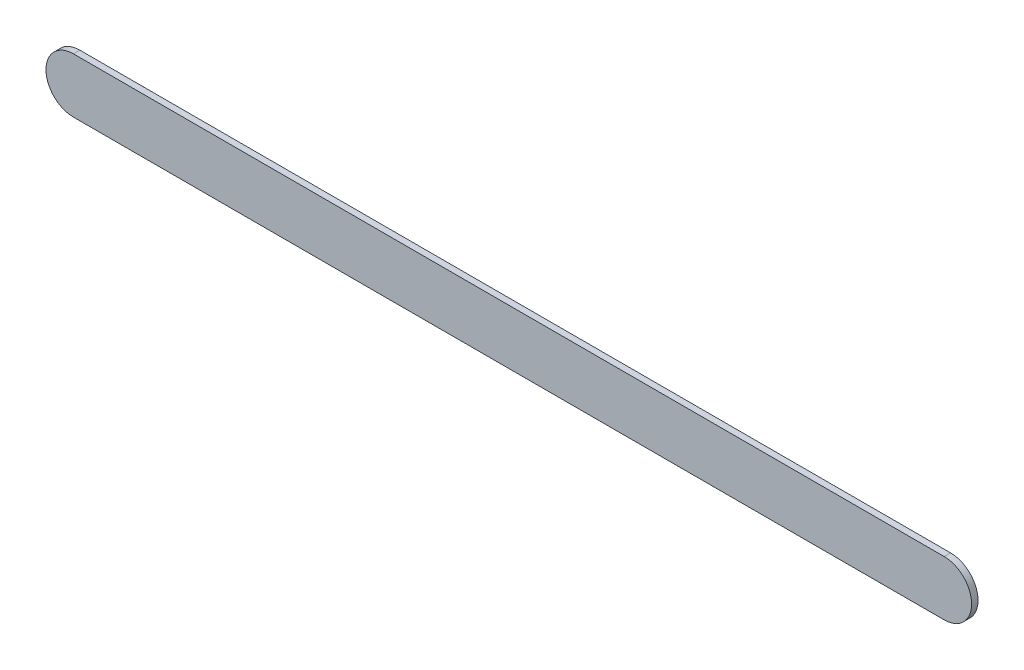
ISO-10303-21;
HEADER;
FILE_DESCRIPTION(('STEP AP214'),'2;1');
FILE_NAME('part.step','',(''),(''),'','','');
FILE_SCHEMA(('AUTOMOTIVE_DESIGN { 1 0 10303 214 1 1 1 1 }'));
ENDSEC;
DATA;
#1=APPLICATION_CONTEXT('core data for automotive mechanical design processes');
#2=APPLICATION_PROTOCOL_DEFINITION('international standard','automotive_design',2000,#1);
#3=PRODUCT_CONTEXT('',#1,'mechanical');
#4=PRODUCT('Part','Part','',(#3));
#5=PRODUCT_RELATED_PRODUCT_CATEGORY('part','',(#4));
#6=PRODUCT_DEFINITION_FORMATION('','',#4);
#7=PRODUCT_DEFINITION_CONTEXT('part definition',#1,'design');
#8=PRODUCT_DEFINITION('design','',#6,#7);
#9=PRODUCT_DEFINITION_SHAPE('','',#8);
#10=(LENGTH_UNIT() NAMED_UNIT(*) SI_UNIT(.MILLI.,.METRE.));
#11=(NAMED_UNIT(*) PLANE_ANGLE_UNIT() SI_UNIT($,.RADIAN.));
#12=(NAMED_UNIT(*) SI_UNIT($,.STERADIAN.) SOLID_ANGLE_UNIT());
#13=UNCERTAINTY_MEASURE_WITH_UNIT(LENGTH_MEASURE(1.E-05),#10,'distance_accuracy_value','');
#14=(GEOMETRIC_REPRESENTATION_CONTEXT(3) GLOBAL_UNCERTAINTY_ASSIGNED_CONTEXT((#13)) GLOBAL_UNIT_ASSIGNED_CONTEXT((#10,
#11,#12)) REPRESENTATION_CONTEXT('',''));
#15=CARTESIAN_POINT('',(0.,0.,0.));
#16=DIRECTION('',(0.,0.,1.));
#17=DIRECTION('',(1.,0.,0.));
#18=AXIS2_PLACEMENT_3D('',#15,#16,#17);
#19=CARTESIAN_POINT('',(129.018,-116.404,1.635));
#20=DIRECTION('',(0.,0.,1.));
#21=DIRECTION('',(1.,0.,0.));
#22=AXIS2_PLACEMENT_3D('',#19,#20,#21);
#23=PLANE('',#22);
#24=DIRECTION('',(-1.,0.,0.));
#25=VECTOR('',#24,1.);
#26=CARTESIAN_POINT('',(129.018,-116.404,1.635));
#27=LINE('',#26,#25);
#28=CARTESIAN_POINT('',(129.018,-116.404,1.635));
#29=VERTEX_POINT('',#28);
#30=CARTESIAN_POINT('',(124.254,-116.404,1.635));
#31=VERTEX_POINT('',#30);
#32=EDGE_CURVE('E94',#29,#31,#27,.T.);
#33=ORIENTED_EDGE('',*,*,#32,.T.);
#34=CARTESIAN_POINT('',(124.254,-116.554,1.635));
#35=DIRECTION('',(0.,0.,1.));
#36=DIRECTION('',(0.,1.,0.));
#37=AXIS2_PLACEMENT_3D('',#34,#35,#36);
#38=CIRCLE('',#37,0.15);
#39=CARTESIAN_POINT('',(124.254,-116.704,1.635));
#40=VERTEX_POINT('',#39);
#41=EDGE_CURVE('E72',#31,#40,#38,.T.);
#42=ORIENTED_EDGE('',*,*,#41,.T.);
#43=DIRECTION('',(1.,0.,0.));
#44=VECTOR('',#43,1.);
#45=CARTESIAN_POINT('',(124.254,-116.704,1.635));
#46=LINE('',#45,#44);
#47=CARTESIAN_POINT('',(129.018,-116.704,1.635));
#48=VERTEX_POINT('',#47);
#49=EDGE_CURVE('E77',#40,#48,#46,.T.);
#50=ORIENTED_EDGE('',*,*,#49,.T.);
#51=CARTESIAN_POINT('',(129.018,-116.554,1.635));
#52=DIRECTION('',(0.,0.,1.));
#53=DIRECTION('',(-1.894780628694E-13,-1.,0.));
#54=AXIS2_PLACEMENT_3D('',#51,#52,#53);
#55=CIRCLE('',#54,0.15);
#56=EDGE_CURVE('E11',#48,#29,#55,.T.);
#57=ORIENTED_EDGE('',*,*,#56,.T.);
#58=EDGE_LOOP('',(#33,#42,#50,#57));
#59=FACE_BOUND('',#58,.T.);
#60=ADVANCED_FACE('F17',(#59),#23,.T.);
#61=CARTESIAN_POINT('',(129.018,-116.404,1.6));
#62=DIRECTION('',(0.,0.,1.));
#63=DIRECTION('',(1.,0.,0.));
#64=AXIS2_PLACEMENT_3D('',#61,#62,#63);
#65=PLANE('',#64);
#66=CARTESIAN_POINT('',(129.018,-116.554,1.6));
#67=DIRECTION('',(0.,0.,1.));
#68=DIRECTION('',(-1.894780628694E-13,-1.,0.));
#69=AXIS2_PLACEMENT_3D('',#66,#67,#68);
#70=CIRCLE('',#69,0.15);
#71=CARTESIAN_POINT('',(129.018,-116.704,1.6));
#72=VERTEX_POINT('',#71);
#73=CARTESIAN_POINT('',(129.018,-116.404,1.6));
#74=VERTEX_POINT('',#73);
#75=EDGE_CURVE('E20',#72,#74,#70,.T.);
#76=ORIENTED_EDGE('',*,*,#75,.F.);
#77=DIRECTION('',(1.,0.,0.));
#78=VECTOR('',#77,1.);
#79=CARTESIAN_POINT('',(124.254,-116.704,1.6));
#80=LINE('',#79,#78);
#81=CARTESIAN_POINT('',(124.254,-116.704,1.6));
#82=VERTEX_POINT('',#81);
#83=EDGE_CURVE('E61',#82,#72,#80,.T.);
#84=ORIENTED_EDGE('',*,*,#83,.F.);
#85=CARTESIAN_POINT('',(124.254,-116.554,1.6));
#86=DIRECTION('',(0.,0.,1.));
#87=DIRECTION('',(0.,1.,0.));
#88=AXIS2_PLACEMENT_3D('',#85,#86,#87);
#89=CIRCLE('',#88,0.15);
#90=CARTESIAN_POINT('',(124.254,-116.404,1.6));
#91=VERTEX_POINT('',#90);
#92=EDGE_CURVE('E66',#91,#82,#89,.T.);
#93=ORIENTED_EDGE('',*,*,#92,.F.);
#94=DIRECTION('',(-1.,0.,0.));
#95=VECTOR('',#94,1.);
#96=CARTESIAN_POINT('',(129.018,-116.404,1.6));
#97=LINE('',#96,#95);
#98=EDGE_CURVE('E107',#74,#91,#97,.T.);
#99=ORIENTED_EDGE('',*,*,#98,.F.);
#100=EDGE_LOOP('',(#76,#84,#93,#99));
#101=FACE_BOUND('',#100,.T.);
#102=ADVANCED_FACE('F63',(#101),#65,.F.);
#103=CARTESIAN_POINT('',(129.018,-116.554,1.6));
#104=DIRECTION('',(0.,0.,-1.));
#105=DIRECTION('',(-1.894780628694E-13,-1.,0.));
#106=AXIS2_PLACEMENT_3D('',#103,#104,#105);
#107=CYLINDRICAL_SURFACE('',#106,0.15);
#108=ORIENTED_EDGE('',*,*,#75,.T.);
#109=DIRECTION('',(0.,0.,1.));
#110=VECTOR('',#109,1.);
#111=CARTESIAN_POINT('',(129.018,-116.404,1.6));
#112=LINE('',#111,#110);
#113=EDGE_CURVE('E88',#74,#29,#112,.T.);
#114=ORIENTED_EDGE('',*,*,#113,.T.);
#115=ORIENTED_EDGE('',*,*,#56,.F.);
#116=DIRECTION('',(0.,0.,1.));
#117=VECTOR('',#116,1.);
#118=CARTESIAN_POINT('',(129.018,-116.704,1.6));
#119=LINE('',#118,#117);
#120=EDGE_CURVE('E71',#72,#48,#119,.T.);
#121=ORIENTED_EDGE('',*,*,#120,.F.);
#122=EDGE_LOOP('',(#108,#114,#115,#121));
#123=FACE_BOUND('',#122,.T.);
#124=ADVANCED_FACE('F171',(#123),#107,.T.);
#125=CARTESIAN_POINT('',(124.254,-116.704,1.6));
#126=DIRECTION('',(0.,1.,0.));
#127=DIRECTION('',(1.,0.,0.));
#128=AXIS2_PLACEMENT_3D('',#125,#126,#127);
#129=PLANE('',#128);
#130=ORIENTED_EDGE('',*,*,#83,.T.);
#131=ORIENTED_EDGE('',*,*,#120,.T.);
#132=ORIENTED_EDGE('',*,*,#49,.F.);
#133=DIRECTION('',(0.,0.,1.));
#134=VECTOR('',#133,1.);
#135=CARTESIAN_POINT('',(124.254,-116.704,1.6));
#136=LINE('',#135,#134);
#137=EDGE_CURVE('E75',#82,#40,#136,.T.);
#138=ORIENTED_EDGE('',*,*,#137,.F.);
#139=EDGE_LOOP('',(#130,#131,#132,#138));
#140=FACE_BOUND('',#139,.T.);
#141=ADVANCED_FACE('F76',(#140),#129,.F.);
#142=CARTESIAN_POINT('',(124.254,-116.554,1.6));
#143=DIRECTION('',(0.,0.,-1.));
#144=DIRECTION('',(0.,1.,0.));
#145=AXIS2_PLACEMENT_3D('',#142,#143,#144);
#146=CYLINDRICAL_SURFACE('',#145,0.15);
#147=ORIENTED_EDGE('',*,*,#92,.T.);
#148=ORIENTED_EDGE('',*,*,#137,.T.);
#149=ORIENTED_EDGE('',*,*,#41,.F.);
#150=DIRECTION('',(0.,0.,1.));
#151=VECTOR('',#150,1.);
#152=CARTESIAN_POINT('',(124.254,-116.404,1.6));
#153=LINE('',#152,#151);
#154=EDGE_CURVE('E85',#91,#31,#153,.T.);
#155=ORIENTED_EDGE('',*,*,#154,.F.);
#156=EDGE_LOOP('',(#147,#148,#149,#155));
#157=FACE_BOUND('',#156,.T.);
#158=ADVANCED_FACE('F83',(#157),#146,.T.);
#159=CARTESIAN_POINT('',(129.018,-116.404,1.6));
#160=DIRECTION('',(0.,-1.,0.));
#161=DIRECTION('',(0.,0.,-1.));
#162=AXIS2_PLACEMENT_3D('',#159,#160,#161);
#163=PLANE('',#162);
#164=ORIENTED_EDGE('',*,*,#98,.T.);
#165=ORIENTED_EDGE('',*,*,#154,.T.);
#166=ORIENTED_EDGE('',*,*,#32,.F.);
#167=ORIENTED_EDGE('',*,*,#113,.F.);
#168=EDGE_LOOP('',(#164,#165,#166,#167));
#169=FACE_BOUND('',#168,.T.);
#170=ADVANCED_FACE('F118',(#169),#163,.F.);
#171=CLOSED_SHELL('',(#60,#102,#124,#141,#158,#170));
#172=MANIFOLD_SOLID_BREP('B1',#171);
#173=ADVANCED_BREP_SHAPE_REPRESENTATION('',(#18,#172),#14);
#174=SHAPE_DEFINITION_REPRESENTATION(#9,#173);
ENDSEC;
END-ISO-10303-21;
